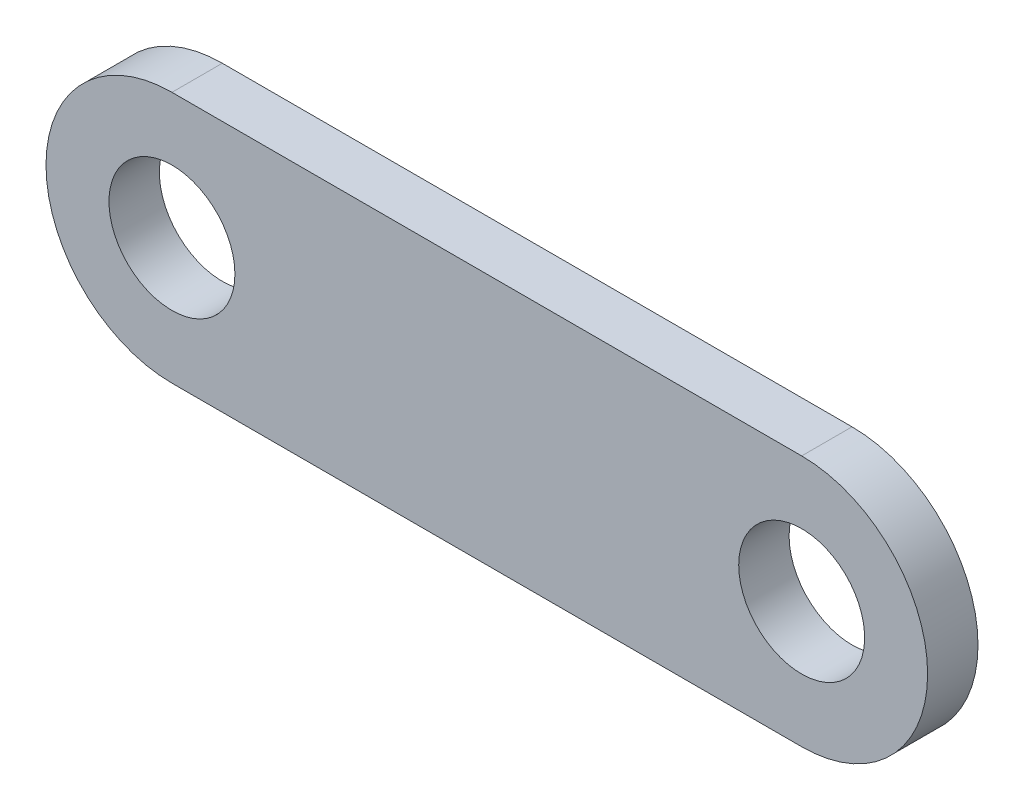
ISO-10303-21;
HEADER;
FILE_DESCRIPTION(('STEP AP214'),'2;1');
FILE_NAME('part.step','',(''),(''),'','','');
FILE_SCHEMA(('AUTOMOTIVE_DESIGN { 1 0 10303 214 1 1 1 1 }'));
ENDSEC;
DATA;
#1=APPLICATION_CONTEXT('core data for automotive mechanical design processes');
#2=APPLICATION_PROTOCOL_DEFINITION('international standard','automotive_design',2000,#1);
#3=PRODUCT_CONTEXT('',#1,'mechanical');
#4=PRODUCT('Part','Part','',(#3));
#5=PRODUCT_RELATED_PRODUCT_CATEGORY('part','',(#4));
#6=PRODUCT_DEFINITION_FORMATION('','',#4);
#7=PRODUCT_DEFINITION_CONTEXT('part definition',#1,'design');
#8=PRODUCT_DEFINITION('design','',#6,#7);
#9=PRODUCT_DEFINITION_SHAPE('','',#8);
#10=(LENGTH_UNIT() NAMED_UNIT(*) SI_UNIT(.MILLI.,.METRE.));
#11=(NAMED_UNIT(*) PLANE_ANGLE_UNIT() SI_UNIT($,.RADIAN.));
#12=(NAMED_UNIT(*) SI_UNIT($,.STERADIAN.) SOLID_ANGLE_UNIT());
#13=UNCERTAINTY_MEASURE_WITH_UNIT(LENGTH_MEASURE(1.E-05),#10,'distance_accuracy_value','');
#14=(GEOMETRIC_REPRESENTATION_CONTEXT(3) GLOBAL_UNCERTAINTY_ASSIGNED_CONTEXT((#13)) GLOBAL_UNIT_ASSIGNED_CONTEXT((#10,
#11,#12)) REPRESENTATION_CONTEXT('',''));
#15=CARTESIAN_POINT('',(0.,0.,0.));
#16=DIRECTION('',(0.,0.,1.));
#17=DIRECTION('',(1.,0.,0.));
#18=AXIS2_PLACEMENT_3D('',#15,#16,#17);
#19=CARTESIAN_POINT('',(-125.,0.,20.));
#20=DIRECTION('',(0.,0.,-1.));
#21=DIRECTION('',(-1.,0.,0.));
#22=AXIS2_PLACEMENT_3D('',#19,#20,#21);
#23=PLANE('',#22);
#24=CARTESIAN_POINT('',(-125.,0.,20.));
#25=DIRECTION('',(0.,0.,1.));
#26=DIRECTION('',(-1.,0.,0.));
#27=AXIS2_PLACEMENT_3D('',#24,#25,#26);
#28=CIRCLE('',#27,50.);
#29=CARTESIAN_POINT('',(-125.,50.,20.));
#30=VERTEX_POINT('',#29);
#31=CARTESIAN_POINT('',(-125.,-50.,20.));
#32=VERTEX_POINT('',#31);
#33=EDGE_CURVE('E88',#30,#32,#28,.T.);
#34=ORIENTED_EDGE('',*,*,#33,.T.);
#35=DIRECTION('',(1.,0.,0.));
#36=VECTOR('',#35,1.);
#37=CARTESIAN_POINT('',(125.,-50.,20.));
#38=LINE('',#37,#36);
#39=CARTESIAN_POINT('',(125.,-50.,20.));
#40=VERTEX_POINT('',#39);
#41=EDGE_CURVE('E83',#32,#40,#38,.T.);
#42=ORIENTED_EDGE('',*,*,#41,.T.);
#43=CARTESIAN_POINT('',(125.,0.,20.));
#44=DIRECTION('',(0.,0.,1.));
#45=DIRECTION('',(1.,0.,0.));
#46=AXIS2_PLACEMENT_3D('',#43,#44,#45);
#47=CIRCLE('',#46,50.);
#48=CARTESIAN_POINT('',(125.,50.,20.));
#49=VERTEX_POINT('',#48);
#50=EDGE_CURVE('E86',#40,#49,#47,.T.);
#51=ORIENTED_EDGE('',*,*,#50,.T.);
#52=DIRECTION('',(-1.,0.,0.));
#53=VECTOR('',#52,1.);
#54=CARTESIAN_POINT('',(125.,50.,20.));
#55=LINE('',#54,#53);
#56=EDGE_CURVE('E53',#49,#30,#55,.T.);
#57=ORIENTED_EDGE('',*,*,#56,.T.);
#58=EDGE_LOOP('',(#34,#42,#51,#57));
#59=FACE_BOUND('',#58,.T.);
#60=CARTESIAN_POINT('',(-125.,0.,20.));
#61=DIRECTION('',(0.,0.,1.));
#62=DIRECTION('',(1.,0.,0.));
#63=AXIS2_PLACEMENT_3D('',#60,#61,#62);
#64=CIRCLE('',#63,25.);
#65=CARTESIAN_POINT('',(-100.,0.,20.));
#66=VERTEX_POINT('',#65);
#67=EDGE_CURVE('E103',#66,#66,#64,.T.);
#68=ORIENTED_EDGE('',*,*,#67,.F.);
#69=EDGE_LOOP('',(#68));
#70=FACE_BOUND('',#69,.T.);
#71=CARTESIAN_POINT('',(125.,0.,20.));
#72=DIRECTION('',(0.,0.,1.));
#73=DIRECTION('',(-1.,0.,0.));
#74=AXIS2_PLACEMENT_3D('',#71,#72,#73);
#75=CIRCLE('',#74,25.0000000000001);
#76=CARTESIAN_POINT('',(99.9999999999999,0.,20.));
#77=VERTEX_POINT('',#76);
#78=EDGE_CURVE('E118',#77,#77,#75,.T.);
#79=ORIENTED_EDGE('',*,*,#78,.F.);
#80=EDGE_LOOP('',(#79));
#81=FACE_BOUND('',#80,.T.);
#82=ADVANCED_FACE('F36',(#59,#70,#81),#23,.F.);
#83=CARTESIAN_POINT('',(-125.,0.,0.));
#84=DIRECTION('',(0.,0.,-1.));
#85=DIRECTION('',(-1.,0.,0.));
#86=AXIS2_PLACEMENT_3D('',#83,#84,#85);
#87=PLANE('',#86);
#88=CARTESIAN_POINT('',(-125.,0.,0.));
#89=DIRECTION('',(0.,0.,1.));
#90=DIRECTION('',(1.,0.,0.));
#91=AXIS2_PLACEMENT_3D('',#88,#89,#90);
#92=CIRCLE('',#91,25.);
#93=CARTESIAN_POINT('',(-100.,0.,0.));
#94=VERTEX_POINT('',#93);
#95=EDGE_CURVE('E115',#94,#94,#92,.T.);
#96=ORIENTED_EDGE('',*,*,#95,.T.);
#97=EDGE_LOOP('',(#96));
#98=FACE_BOUND('',#97,.T.);
#99=CARTESIAN_POINT('',(-125.,0.,0.));
#100=DIRECTION('',(0.,0.,1.));
#101=DIRECTION('',(-1.,0.,0.));
#102=AXIS2_PLACEMENT_3D('',#99,#100,#101);
#103=CIRCLE('',#102,50.);
#104=CARTESIAN_POINT('',(-125.,50.,0.));
#105=VERTEX_POINT('',#104);
#106=CARTESIAN_POINT('',(-125.,-50.,0.));
#107=VERTEX_POINT('',#106);
#108=EDGE_CURVE('E100',#105,#107,#103,.T.);
#109=ORIENTED_EDGE('',*,*,#108,.F.);
#110=DIRECTION('',(-1.,0.,0.));
#111=VECTOR('',#110,1.);
#112=CARTESIAN_POINT('',(125.,50.,0.));
#113=LINE('',#112,#111);
#114=CARTESIAN_POINT('',(125.,50.,0.));
#115=VERTEX_POINT('',#114);
#116=EDGE_CURVE('E76',#115,#105,#113,.T.);
#117=ORIENTED_EDGE('',*,*,#116,.F.);
#118=CARTESIAN_POINT('',(125.,0.,0.));
#119=DIRECTION('',(0.,0.,1.));
#120=DIRECTION('',(1.,0.,0.));
#121=AXIS2_PLACEMENT_3D('',#118,#119,#120);
#122=CIRCLE('',#121,50.);
#123=CARTESIAN_POINT('',(125.,-50.,0.));
#124=VERTEX_POINT('',#123);
#125=EDGE_CURVE('E70',#124,#115,#122,.T.);
#126=ORIENTED_EDGE('',*,*,#125,.F.);
#127=DIRECTION('',(1.,0.,0.));
#128=VECTOR('',#127,1.);
#129=CARTESIAN_POINT('',(125.,-50.,0.));
#130=LINE('',#129,#128);
#131=EDGE_CURVE('E92',#107,#124,#130,.T.);
#132=ORIENTED_EDGE('',*,*,#131,.F.);
#133=EDGE_LOOP('',(#109,#117,#126,#132));
#134=FACE_BOUND('',#133,.T.);
#135=CARTESIAN_POINT('',(125.,0.,0.));
#136=DIRECTION('',(0.,0.,1.));
#137=DIRECTION('',(-1.,0.,0.));
#138=AXIS2_PLACEMENT_3D('',#135,#136,#137);
#139=CIRCLE('',#138,25.0000000000001);
#140=CARTESIAN_POINT('',(99.9999999999999,0.,0.));
#141=VERTEX_POINT('',#140);
#142=EDGE_CURVE('E121',#141,#141,#139,.T.);
#143=ORIENTED_EDGE('',*,*,#142,.T.);
#144=EDGE_LOOP('',(#143));
#145=FACE_BOUND('',#144,.T.);
#146=ADVANCED_FACE('F111',(#98,#134,#145),#87,.T.);
#147=CARTESIAN_POINT('',(-125.,0.,20.));
#148=DIRECTION('',(0.,0.,-1.));
#149=DIRECTION('',(-1.,0.,0.));
#150=AXIS2_PLACEMENT_3D('',#147,#148,#149);
#151=CYLINDRICAL_SURFACE('',#150,50.);
#152=ORIENTED_EDGE('',*,*,#108,.T.);
#153=DIRECTION('',(0.,0.,-1.));
#154=VECTOR('',#153,1.);
#155=CARTESIAN_POINT('',(-125.,-50.,20.));
#156=LINE('',#155,#154);
#157=EDGE_CURVE('E11',#32,#107,#156,.T.);
#158=ORIENTED_EDGE('',*,*,#157,.F.);
#159=ORIENTED_EDGE('',*,*,#33,.F.);
#160=DIRECTION('',(0.,0.,-1.));
#161=VECTOR('',#160,1.);
#162=CARTESIAN_POINT('',(-125.,50.,20.));
#163=LINE('',#162,#161);
#164=EDGE_CURVE('E96',#30,#105,#163,.T.);
#165=ORIENTED_EDGE('',*,*,#164,.T.);
#166=EDGE_LOOP('',(#152,#158,#159,#165));
#167=FACE_BOUND('',#166,.T.);
#168=ADVANCED_FACE('F38',(#167),#151,.T.);
#169=CARTESIAN_POINT('',(125.,-50.,20.));
#170=DIRECTION('',(0.,1.,0.));
#171=DIRECTION('',(0.,0.,1.));
#172=AXIS2_PLACEMENT_3D('',#169,#170,#171);
#173=PLANE('',#172);
#174=ORIENTED_EDGE('',*,*,#131,.T.);
#175=DIRECTION('',(0.,0.,-1.));
#176=VECTOR('',#175,1.);
#177=CARTESIAN_POINT('',(125.,-50.,20.));
#178=LINE('',#177,#176);
#179=EDGE_CURVE('E45',#40,#124,#178,.T.);
#180=ORIENTED_EDGE('',*,*,#179,.F.);
#181=ORIENTED_EDGE('',*,*,#41,.F.);
#182=ORIENTED_EDGE('',*,*,#157,.T.);
#183=EDGE_LOOP('',(#174,#180,#181,#182));
#184=FACE_BOUND('',#183,.T.);
#185=ADVANCED_FACE('F91',(#184),#173,.F.);
#186=CARTESIAN_POINT('',(125.,0.,20.));
#187=DIRECTION('',(0.,0.,-1.));
#188=DIRECTION('',(-1.,0.,0.));
#189=AXIS2_PLACEMENT_3D('',#186,#187,#188);
#190=CYLINDRICAL_SURFACE('',#189,50.);
#191=ORIENTED_EDGE('',*,*,#125,.T.);
#192=DIRECTION('',(0.,0.,-1.));
#193=VECTOR('',#192,1.);
#194=CARTESIAN_POINT('',(125.,50.,20.));
#195=LINE('',#194,#193);
#196=EDGE_CURVE('E93',#49,#115,#195,.T.);
#197=ORIENTED_EDGE('',*,*,#196,.F.);
#198=ORIENTED_EDGE('',*,*,#50,.F.);
#199=ORIENTED_EDGE('',*,*,#179,.T.);
#200=EDGE_LOOP('',(#191,#197,#198,#199));
#201=FACE_BOUND('',#200,.T.);
#202=ADVANCED_FACE('F94',(#201),#190,.T.);
#203=CARTESIAN_POINT('',(125.,50.,20.));
#204=DIRECTION('',(0.,-1.,0.));
#205=DIRECTION('',(1.,0.,0.));
#206=AXIS2_PLACEMENT_3D('',#203,#204,#205);
#207=PLANE('',#206);
#208=ORIENTED_EDGE('',*,*,#116,.T.);
#209=ORIENTED_EDGE('',*,*,#164,.F.);
#210=ORIENTED_EDGE('',*,*,#56,.F.);
#211=ORIENTED_EDGE('',*,*,#196,.T.);
#212=EDGE_LOOP('',(#208,#209,#210,#211));
#213=FACE_BOUND('',#212,.T.);
#214=ADVANCED_FACE('F108',(#213),#207,.F.);
#215=CARTESIAN_POINT('',(-125.,0.,20.));
#216=DIRECTION('',(0.,0.,-1.));
#217=DIRECTION('',(-1.,0.,0.));
#218=AXIS2_PLACEMENT_3D('',#215,#216,#217);
#219=CYLINDRICAL_SURFACE('',#218,25.);
#220=ORIENTED_EDGE('',*,*,#67,.T.);
#221=EDGE_LOOP('',(#220));
#222=FACE_BOUND('',#221,.T.);
#223=ORIENTED_EDGE('',*,*,#95,.F.);
#224=EDGE_LOOP('',(#223));
#225=FACE_BOUND('',#224,.T.);
#226=ADVANCED_FACE('F138',(#222,#225),#219,.F.);
#227=CARTESIAN_POINT('',(125.,0.,20.));
#228=DIRECTION('',(0.,0.,-1.));
#229=DIRECTION('',(-1.,0.,0.));
#230=AXIS2_PLACEMENT_3D('',#227,#228,#229);
#231=CYLINDRICAL_SURFACE('',#230,25.0000000000001);
#232=ORIENTED_EDGE('',*,*,#78,.T.);
#233=EDGE_LOOP('',(#232));
#234=FACE_BOUND('',#233,.T.);
#235=ORIENTED_EDGE('',*,*,#142,.F.);
#236=EDGE_LOOP('',(#235));
#237=FACE_BOUND('',#236,.T.);
#238=ADVANCED_FACE('F127',(#234,#237),#231,.F.);
#239=CLOSED_SHELL('',(#82,#146,#168,#185,#202,#214,#226,#238));
#240=MANIFOLD_SOLID_BREP('B2',#239);
#241=ADVANCED_BREP_SHAPE_REPRESENTATION('',(#18,#240),#14);
#242=SHAPE_DEFINITION_REPRESENTATION(#9,#241);
ENDSEC;
END-ISO-10303-21;
